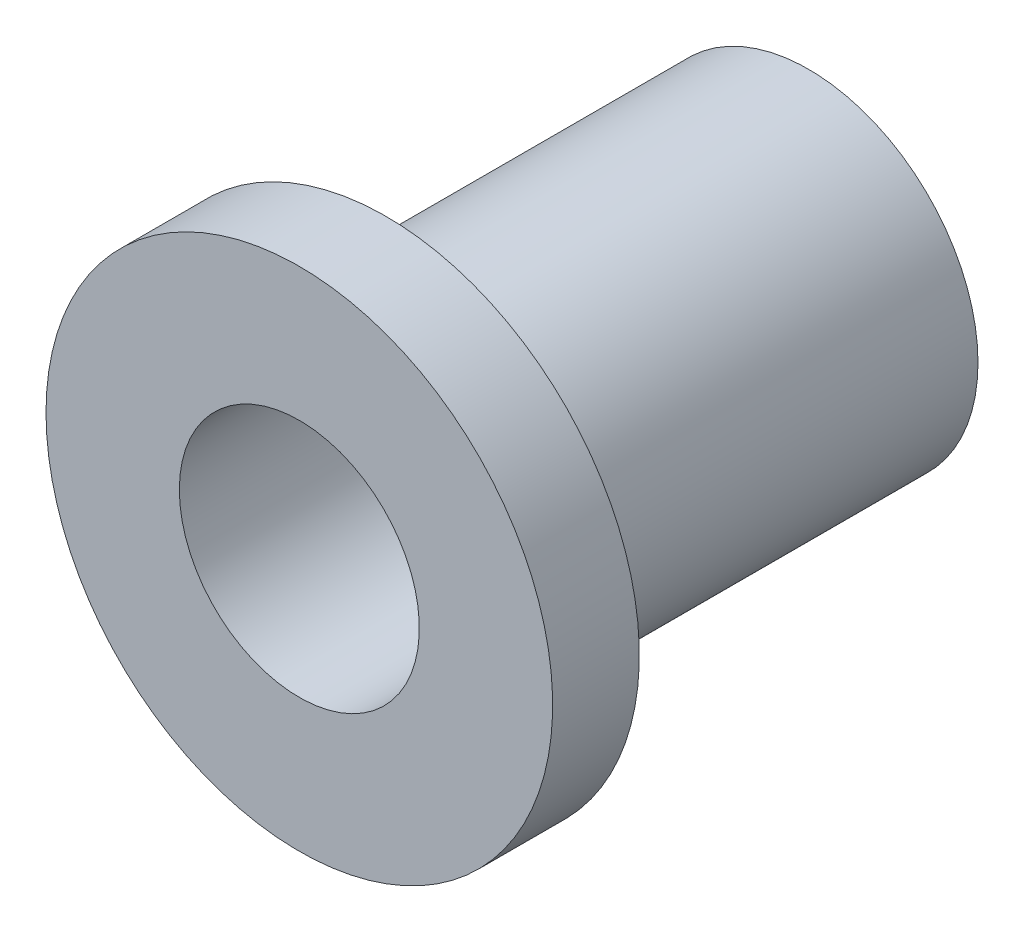
ISO-10303-21;
HEADER;
FILE_DESCRIPTION(('STEP AP214'),'2;1');
FILE_NAME('part.step','',(''),(''),'','','');
FILE_SCHEMA(('AUTOMOTIVE_DESIGN { 1 0 10303 214 1 1 1 1 }'));
ENDSEC;
DATA;
#1=APPLICATION_CONTEXT('core data for automotive mechanical design processes');
#2=APPLICATION_PROTOCOL_DEFINITION('international standard','automotive_design',2000,#1);
#3=PRODUCT_CONTEXT('',#1,'mechanical');
#4=PRODUCT('Part','Part','',(#3));
#5=PRODUCT_RELATED_PRODUCT_CATEGORY('part','',(#4));
#6=PRODUCT_DEFINITION_FORMATION('','',#4);
#7=PRODUCT_DEFINITION_CONTEXT('part definition',#1,'design');
#8=PRODUCT_DEFINITION('design','',#6,#7);
#9=PRODUCT_DEFINITION_SHAPE('','',#8);
#10=(LENGTH_UNIT() NAMED_UNIT(*) SI_UNIT(.MILLI.,.METRE.));
#11=(NAMED_UNIT(*) PLANE_ANGLE_UNIT() SI_UNIT($,.RADIAN.));
#12=(NAMED_UNIT(*) SI_UNIT($,.STERADIAN.) SOLID_ANGLE_UNIT());
#13=UNCERTAINTY_MEASURE_WITH_UNIT(LENGTH_MEASURE(1.E-05),#10,'distance_accuracy_value','');
#14=(GEOMETRIC_REPRESENTATION_CONTEXT(3) GLOBAL_UNCERTAINTY_ASSIGNED_CONTEXT((#13)) GLOBAL_UNIT_ASSIGNED_CONTEXT((#10,
#11,#12)) REPRESENTATION_CONTEXT('',''));
#15=CARTESIAN_POINT('',(0.,0.,0.));
#16=DIRECTION('',(0.,0.,1.));
#17=DIRECTION('',(1.,0.,0.));
#18=AXIS2_PLACEMENT_3D('',#15,#16,#17);
#19=CARTESIAN_POINT('',(0.,0.,0.));
#20=DIRECTION('',(0.,0.,1.));
#21=DIRECTION('',(1.,0.,0.));
#22=AXIS2_PLACEMENT_3D('',#19,#20,#21);
#23=PLANE('',#22);
#24=CARTESIAN_POINT('',(0.,0.,0.));
#25=DIRECTION('',(0.,0.,1.));
#26=DIRECTION('',(1.,0.,0.));
#27=AXIS2_PLACEMENT_3D('',#24,#25,#26);
#28=CIRCLE('',#27,9.5);
#29=CARTESIAN_POINT('',(-9.5,0.,0.));
#30=VERTEX_POINT('',#29);
#31=EDGE_CURVE('E42',#30,#30,#28,.T.);
#32=ORIENTED_EDGE('',*,*,#31,.F.);
#33=EDGE_LOOP('',(#32));
#34=FACE_BOUND('',#33,.T.);
#35=CARTESIAN_POINT('',(0.,0.,0.));
#36=DIRECTION('',(0.,0.,1.));
#37=DIRECTION('',(1.,0.,0.));
#38=AXIS2_PLACEMENT_3D('',#35,#36,#37);
#39=CIRCLE('',#38,6.35);
#40=CARTESIAN_POINT('',(6.35,0.,0.));
#41=VERTEX_POINT('',#40);
#42=EDGE_CURVE('E10',#41,#41,#39,.F.);
#43=ORIENTED_EDGE('',*,*,#42,.F.);
#44=EDGE_LOOP('',(#43));
#45=FACE_BOUND('',#44,.T.);
#46=ADVANCED_FACE('F31',(#34,#45),#23,.F.);
#47=CARTESIAN_POINT('',(0.,0.,3.25));
#48=DIRECTION('',(0.,0.,1.));
#49=DIRECTION('',(1.,0.,0.));
#50=AXIS2_PLACEMENT_3D('',#47,#48,#49);
#51=PLANE('',#50);
#52=CARTESIAN_POINT('',(0.,0.,3.25));
#53=DIRECTION('',(0.,0.,1.));
#54=DIRECTION('',(1.,0.,0.));
#55=AXIS2_PLACEMENT_3D('',#52,#53,#54);
#56=CIRCLE('',#55,9.5);
#57=CARTESIAN_POINT('',(-9.5,0.,3.25));
#58=VERTEX_POINT('',#57);
#59=EDGE_CURVE('E38',#58,#58,#56,.T.);
#60=ORIENTED_EDGE('',*,*,#59,.T.);
#61=EDGE_LOOP('',(#60));
#62=FACE_BOUND('',#61,.T.);
#63=CARTESIAN_POINT('',(0.,0.,3.25));
#64=DIRECTION('',(0.,0.,1.));
#65=DIRECTION('',(1.,0.,0.));
#66=AXIS2_PLACEMENT_3D('',#63,#64,#65);
#67=CIRCLE('',#66,4.5);
#68=CARTESIAN_POINT('',(-4.5,0.,3.25));
#69=VERTEX_POINT('',#68);
#70=EDGE_CURVE('E47',#69,#69,#67,.T.);
#71=ORIENTED_EDGE('',*,*,#70,.F.);
#72=EDGE_LOOP('',(#71));
#73=FACE_BOUND('',#72,.T.);
#74=ADVANCED_FACE('F74',(#62,#73),#51,.T.);
#75=CARTESIAN_POINT('',(0.,0.,3.25));
#76=DIRECTION('',(0.,0.,-1.));
#77=DIRECTION('',(-1.,0.,0.));
#78=AXIS2_PLACEMENT_3D('',#75,#76,#77);
#79=CYLINDRICAL_SURFACE('',#78,9.5);
#80=CARTESIAN_POINT('',(-9.5,0.,3.25));
#81=CARTESIAN_POINT('',(-9.5,0.,3.21614583333333));
#82=CARTESIAN_POINT('',(-9.5,0.,3.18229166666667));
#83=CARTESIAN_POINT('',(-9.5,0.,3.11458333333333));
#84=CARTESIAN_POINT('',(-9.5,0.,3.08072916666667));
#85=CARTESIAN_POINT('',(-9.5,0.,3.01302083333333));
#86=CARTESIAN_POINT('',(-9.5,0.,2.97916666666667));
#87=CARTESIAN_POINT('',(-9.5,0.,2.91145833333333));
#88=CARTESIAN_POINT('',(-9.5,0.,2.87760416666667));
#89=CARTESIAN_POINT('',(-9.5,0.,2.80989583333333));
#90=CARTESIAN_POINT('',(-9.5,0.,2.77604166666667));
#91=CARTESIAN_POINT('',(-9.5,0.,2.70833333333333));
#92=CARTESIAN_POINT('',(-9.5,0.,2.67447916666667));
#93=CARTESIAN_POINT('',(-9.5,0.,2.60677083333333));
#94=CARTESIAN_POINT('',(-9.5,0.,2.57291666666667));
#95=CARTESIAN_POINT('',(-9.5,0.,2.50520833333333));
#96=CARTESIAN_POINT('',(-9.5,0.,2.47135416666667));
#97=CARTESIAN_POINT('',(-9.5,0.,2.40364583333333));
#98=CARTESIAN_POINT('',(-9.5,0.,2.36979166666667));
#99=CARTESIAN_POINT('',(-9.5,0.,2.30208333333333));
#100=CARTESIAN_POINT('',(-9.5,0.,2.26822916666667));
#101=CARTESIAN_POINT('',(-9.5,0.,2.20052083333333));
#102=CARTESIAN_POINT('',(-9.5,0.,2.16666666666667));
#103=CARTESIAN_POINT('',(-9.5,0.,2.09895833333333));
#104=CARTESIAN_POINT('',(-9.5,0.,2.06510416666667));
#105=CARTESIAN_POINT('',(-9.5,0.,1.99739583333333));
#106=CARTESIAN_POINT('',(-9.5,0.,1.96354166666667));
#107=CARTESIAN_POINT('',(-9.5,0.,1.89583333333333));
#108=CARTESIAN_POINT('',(-9.5,0.,1.86197916666667));
#109=CARTESIAN_POINT('',(-9.5,0.,1.79427083333333));
#110=CARTESIAN_POINT('',(-9.5,0.,1.76041666666667));
#111=CARTESIAN_POINT('',(-9.5,0.,1.69270833333333));
#112=CARTESIAN_POINT('',(-9.5,0.,1.65885416666667));
#113=CARTESIAN_POINT('',(-9.5,0.,1.59114583333333));
#114=CARTESIAN_POINT('',(-9.5,0.,1.55729166666667));
#115=CARTESIAN_POINT('',(-9.5,0.,1.48958333333333));
#116=CARTESIAN_POINT('',(-9.5,0.,1.45572916666667));
#117=CARTESIAN_POINT('',(-9.5,0.,1.38802083333333));
#118=CARTESIAN_POINT('',(-9.5,0.,1.35416666666667));
#119=CARTESIAN_POINT('',(-9.5,0.,1.28645833333333));
#120=CARTESIAN_POINT('',(-9.5,0.,1.25260416666667));
#121=CARTESIAN_POINT('',(-9.5,0.,1.18489583333333));
#122=CARTESIAN_POINT('',(-9.5,0.,1.15104166666667));
#123=CARTESIAN_POINT('',(-9.5,0.,1.08333333333333));
#124=CARTESIAN_POINT('',(-9.5,0.,1.04947916666667));
#125=CARTESIAN_POINT('',(-9.5,0.,0.981770833333333));
#126=CARTESIAN_POINT('',(-9.5,0.,0.947916666666667));
#127=CARTESIAN_POINT('',(-9.5,0.,0.880208333333333));
#128=CARTESIAN_POINT('',(-9.5,0.,0.846354166666667));
#129=CARTESIAN_POINT('',(-9.5,0.,0.778645833333333));
#130=CARTESIAN_POINT('',(-9.5,0.,0.744791666666667));
#131=CARTESIAN_POINT('',(-9.5,0.,0.677083333333333));
#132=CARTESIAN_POINT('',(-9.5,0.,0.643229166666667));
#133=CARTESIAN_POINT('',(-9.5,0.,0.575520833333333));
#134=CARTESIAN_POINT('',(-9.5,0.,0.541666666666667));
#135=CARTESIAN_POINT('',(-9.5,0.,0.473958333333333));
#136=CARTESIAN_POINT('',(-9.5,0.,0.440104166666667));
#137=CARTESIAN_POINT('',(-9.5,0.,0.372395833333333));
#138=CARTESIAN_POINT('',(-9.5,0.,0.338541666666667));
#139=CARTESIAN_POINT('',(-9.5,0.,0.270833333333333));
#140=CARTESIAN_POINT('',(-9.5,0.,0.236979166666667));
#141=CARTESIAN_POINT('',(-9.5,0.,0.169270833333333));
#142=CARTESIAN_POINT('',(-9.5,0.,0.135416666666667));
#143=CARTESIAN_POINT('',(-9.5,0.,0.0677083333333334));
#144=CARTESIAN_POINT('',(-9.5,0.,0.0338541666666667));
#145=CARTESIAN_POINT('',(-9.5,0.,0.));
#146=B_SPLINE_CURVE_WITH_KNOTS('',3,(#80,#81,#82,#83,#84,#85,#86,#87,#88,#89,#90,#91,#92,#93,
#94,#95,#96,#97,#98,#99,#100,#101,#102,#103,#104,#105,#106,#107,#108,#109,#110,#111,#112,#113,
#114,#115,#116,#117,#118,#119,#120,#121,#122,#123,#124,#125,#126,#127,#128,#129,#130,#131,#132,
#133,#134,#135,#136,#137,#138,#139,#140,#141,#142,#143,#144,#145),.UNSPECIFIED.,.F.,.F.,(4,2,2,
2,2,2,2,2,2,2,2,2,2,2,2,2,2,2,2,2,2,2,2,2,2,2,2,2,2,2,2,2,4),(0.,0.1015625,0.203125,0.3046875,
0.40625,0.5078125,0.609375,0.7109375,0.8125,0.9140625,1.015625,1.1171875,1.21875,1.3203125,
1.421875,1.5234375,1.625,1.7265625,1.828125,1.9296875,2.03125,2.1328125,2.234375,2.3359375,
2.4375,2.5390625,2.640625,2.7421875,2.84375,2.9453125,3.046875,3.1484375,3.25),.UNSPECIFIED.);
#147=EDGE_CURVE('BSEAM33',#58,#30,#146,.T.);
#148=ORIENTED_EDGE('',*,*,#59,.F.);
#149=ORIENTED_EDGE('',*,*,#31,.T.);
#150=ORIENTED_EDGE('',*,*,#147,.T.);
#151=ORIENTED_EDGE('',*,*,#147,.F.);
#152=EDGE_LOOP('',(#148,#150,#149,#151));
#153=FACE_BOUND('',#152,.T.);
#154=ADVANCED_FACE('F33',(#153),#79,.T.);
#155=CARTESIAN_POINT('',(0.,0.,3.25));
#156=DIRECTION('',(0.,0.,-1.));
#157=DIRECTION('',(-1.,0.,0.));
#158=AXIS2_PLACEMENT_3D('',#155,#156,#157);
#159=CYLINDRICAL_SURFACE('',#158,4.5);
#160=CARTESIAN_POINT('',(0.,0.,-15.85));
#161=DIRECTION('',(0.,0.,-1.));
#162=DIRECTION('',(-1.,0.,0.));
#163=AXIS2_PLACEMENT_3D('',#160,#161,#162);
#164=CIRCLE('',#163,4.5);
#165=CARTESIAN_POINT('',(-4.5,0.,-15.85));
#166=VERTEX_POINT('',#165);
#167=EDGE_CURVE('E54',#166,#166,#164,.T.);
#168=CARTESIAN_POINT('',(-4.5,0.,3.25));
#169=CARTESIAN_POINT('',(-4.5,0.,3.05104166666667));
#170=CARTESIAN_POINT('',(-4.5,0.,2.85208333333333));
#171=CARTESIAN_POINT('',(-4.5,0.,2.45416666666667));
#172=CARTESIAN_POINT('',(-4.5,0.,2.25520833333333));
#173=CARTESIAN_POINT('',(-4.5,0.,1.85729166666667));
#174=CARTESIAN_POINT('',(-4.5,0.,1.65833333333333));
#175=CARTESIAN_POINT('',(-4.5,0.,1.26041666666667));
#176=CARTESIAN_POINT('',(-4.5,0.,1.06145833333333));
#177=CARTESIAN_POINT('',(-4.5,0.,0.663541666666667));
#178=CARTESIAN_POINT('',(-4.5,0.,0.464583333333334));
#179=CARTESIAN_POINT('',(-4.5,0.,0.066666666666667));
#180=CARTESIAN_POINT('',(-4.5,0.,-0.132291666666666));
#181=CARTESIAN_POINT('',(-4.5,0.,-0.530208333333333));
#182=CARTESIAN_POINT('',(-4.5,0.,-0.729166666666666));
#183=CARTESIAN_POINT('',(-4.5,0.,-1.12708333333333));
#184=CARTESIAN_POINT('',(-4.5,0.,-1.32604166666667));
#185=CARTESIAN_POINT('',(-4.5,0.,-1.72395833333333));
#186=CARTESIAN_POINT('',(-4.5,0.,-1.92291666666667));
#187=CARTESIAN_POINT('',(-4.5,0.,-2.32083333333333));
#188=CARTESIAN_POINT('',(-4.5,0.,-2.51979166666667));
#189=CARTESIAN_POINT('',(-4.5,0.,-2.91770833333333));
#190=CARTESIAN_POINT('',(-4.5,0.,-3.11666666666667));
#191=CARTESIAN_POINT('',(-4.5,0.,-3.51458333333333));
#192=CARTESIAN_POINT('',(-4.5,0.,-3.71354166666667));
#193=CARTESIAN_POINT('',(-4.5,0.,-4.11145833333333));
#194=CARTESIAN_POINT('',(-4.5,0.,-4.31041666666667));
#195=CARTESIAN_POINT('',(-4.5,0.,-4.70833333333333));
#196=CARTESIAN_POINT('',(-4.5,0.,-4.90729166666666));
#197=CARTESIAN_POINT('',(-4.5,0.,-5.30520833333333));
#198=CARTESIAN_POINT('',(-4.5,0.,-5.50416666666666));
#199=CARTESIAN_POINT('',(-4.5,0.,-5.90208333333333));
#200=CARTESIAN_POINT('',(-4.5,0.,-6.10104166666667));
#201=CARTESIAN_POINT('',(-4.5,0.,-6.49895833333333));
#202=CARTESIAN_POINT('',(-4.5,0.,-6.69791666666667));
#203=CARTESIAN_POINT('',(-4.5,0.,-7.09583333333333));
#204=CARTESIAN_POINT('',(-4.5,0.,-7.29479166666667));
#205=CARTESIAN_POINT('',(-4.5,0.,-7.69270833333333));
#206=CARTESIAN_POINT('',(-4.5,0.,-7.89166666666666));
#207=CARTESIAN_POINT('',(-4.5,0.,-8.28958333333333));
#208=CARTESIAN_POINT('',(-4.5,0.,-8.48854166666666));
#209=CARTESIAN_POINT('',(-4.5,0.,-8.88645833333333));
#210=CARTESIAN_POINT('',(-4.5,0.,-9.08541666666667));
#211=CARTESIAN_POINT('',(-4.5,0.,-9.48333333333333));
#212=CARTESIAN_POINT('',(-4.5,0.,-9.68229166666666));
#213=CARTESIAN_POINT('',(-4.5,0.,-10.0802083333333));
#214=CARTESIAN_POINT('',(-4.5,0.,-10.2791666666667));
#215=CARTESIAN_POINT('',(-4.5,0.,-10.6770833333333));
#216=CARTESIAN_POINT('',(-4.5,0.,-10.8760416666667));
#217=CARTESIAN_POINT('',(-4.5,0.,-11.2739583333333));
#218=CARTESIAN_POINT('',(-4.5,0.,-11.4729166666667));
#219=CARTESIAN_POINT('',(-4.5,0.,-11.8708333333333));
#220=CARTESIAN_POINT('',(-4.5,0.,-12.0697916666667));
#221=CARTESIAN_POINT('',(-4.5,0.,-12.4677083333333));
#222=CARTESIAN_POINT('',(-4.5,0.,-12.6666666666667));
#223=CARTESIAN_POINT('',(-4.5,0.,-13.0645833333333));
#224=CARTESIAN_POINT('',(-4.5,0.,-13.2635416666667));
#225=CARTESIAN_POINT('',(-4.5,0.,-13.6614583333333));
#226=CARTESIAN_POINT('',(-4.5,0.,-13.8604166666667));
#227=CARTESIAN_POINT('',(-4.5,0.,-14.2583333333333));
#228=CARTESIAN_POINT('',(-4.5,0.,-14.4572916666667));
#229=CARTESIAN_POINT('',(-4.5,0.,-14.8552083333333));
#230=CARTESIAN_POINT('',(-4.5,0.,-15.0541666666667));
#231=CARTESIAN_POINT('',(-4.5,0.,-15.4520833333333));
#232=CARTESIAN_POINT('',(-4.5,0.,-15.6510416666667));
#233=CARTESIAN_POINT('',(-4.5,0.,-15.85));
#234=B_SPLINE_CURVE_WITH_KNOTS('',3,(#168,#169,#170,#171,#172,#173,#174,#175,#176,#177,#178,
#179,#180,#181,#182,#183,#184,#185,#186,#187,#188,#189,#190,#191,#192,#193,#194,#195,#196,#197,
#198,#199,#200,#201,#202,#203,#204,#205,#206,#207,#208,#209,#210,#211,#212,#213,#214,#215,#216,
#217,#218,#219,#220,#221,#222,#223,#224,#225,#226,#227,#228,#229,#230,#231,#232,#233),
.UNSPECIFIED.,.F.,.F.,(4,2,2,2,2,2,2,2,2,2,2,2,2,2,2,2,2,2,2,2,2,2,2,2,2,2,2,2,2,2,2,2,4),(0.,
0.596875,1.19375,1.790625,2.3875,2.984375,3.58125,4.178125,4.775,5.371875,5.96875,6.565625,
7.1625,7.759375,8.35625,8.953125,9.55,10.146875,10.74375,11.340625,11.9375,12.534375,13.13125,
13.728125,14.325,14.921875,15.51875,16.115625,16.7125,17.309375,17.90625,18.503125,19.1),.UNSPECIFIED.);
#235=EDGE_CURVE('BSEAM58',#69,#166,#234,.T.);
#236=ORIENTED_EDGE('',*,*,#70,.T.);
#237=ORIENTED_EDGE('',*,*,#167,.T.);
#238=ORIENTED_EDGE('',*,*,#235,.T.);
#239=ORIENTED_EDGE('',*,*,#235,.F.);
#240=EDGE_LOOP('',(#236,#238,#237,#239));
#241=FACE_BOUND('',#240,.T.);
#242=ADVANCED_FACE('F58',(#241),#159,.F.);
#243=CARTESIAN_POINT('',(0.,0.,-15.85));
#244=DIRECTION('',(0.,0.,-1.));
#245=DIRECTION('',(-1.,0.,0.));
#246=AXIS2_PLACEMENT_3D('',#243,#244,#245);
#247=PLANE('',#246);
#248=CARTESIAN_POINT('',(0.,0.,-15.85));
#249=DIRECTION('',(0.,0.,-1.));
#250=DIRECTION('',(-1.,0.,0.));
#251=AXIS2_PLACEMENT_3D('',#248,#249,#250);
#252=CIRCLE('',#251,6.35);
#253=CARTESIAN_POINT('',(-6.35,0.,-15.85));
#254=VERTEX_POINT('',#253);
#255=EDGE_CURVE('E51',#254,#254,#252,.T.);
#256=ORIENTED_EDGE('',*,*,#255,.T.);
#257=EDGE_LOOP('',(#256));
#258=FACE_BOUND('',#257,.T.);
#259=ORIENTED_EDGE('',*,*,#167,.F.);
#260=EDGE_LOOP('',(#259));
#261=FACE_BOUND('',#260,.T.);
#262=ADVANCED_FACE('F60',(#258,#261),#247,.T.);
#263=CARTESIAN_POINT('',(0.,0.,-15.85));
#264=DIRECTION('',(0.,0.,1.));
#265=DIRECTION('',(1.,0.,0.));
#266=AXIS2_PLACEMENT_3D('',#263,#264,#265);
#267=CYLINDRICAL_SURFACE('',#266,6.35);
#268=ORIENTED_EDGE('',*,*,#255,.F.);
#269=EDGE_LOOP('',(#268));
#270=FACE_BOUND('',#269,.T.);
#271=ORIENTED_EDGE('',*,*,#42,.T.);
#272=EDGE_LOOP('',(#271));
#273=FACE_BOUND('',#272,.T.);
#274=ADVANCED_FACE('F62',(#270,#273),#267,.T.);
#275=CLOSED_SHELL('',(#46,#74,#154,#242,#262,#274));
#276=MANIFOLD_SOLID_BREP('B2',#275);
#277=ADVANCED_BREP_SHAPE_REPRESENTATION('',(#18,#276),#14);
#278=SHAPE_DEFINITION_REPRESENTATION(#9,#277);
ENDSEC;
END-ISO-10303-21;
